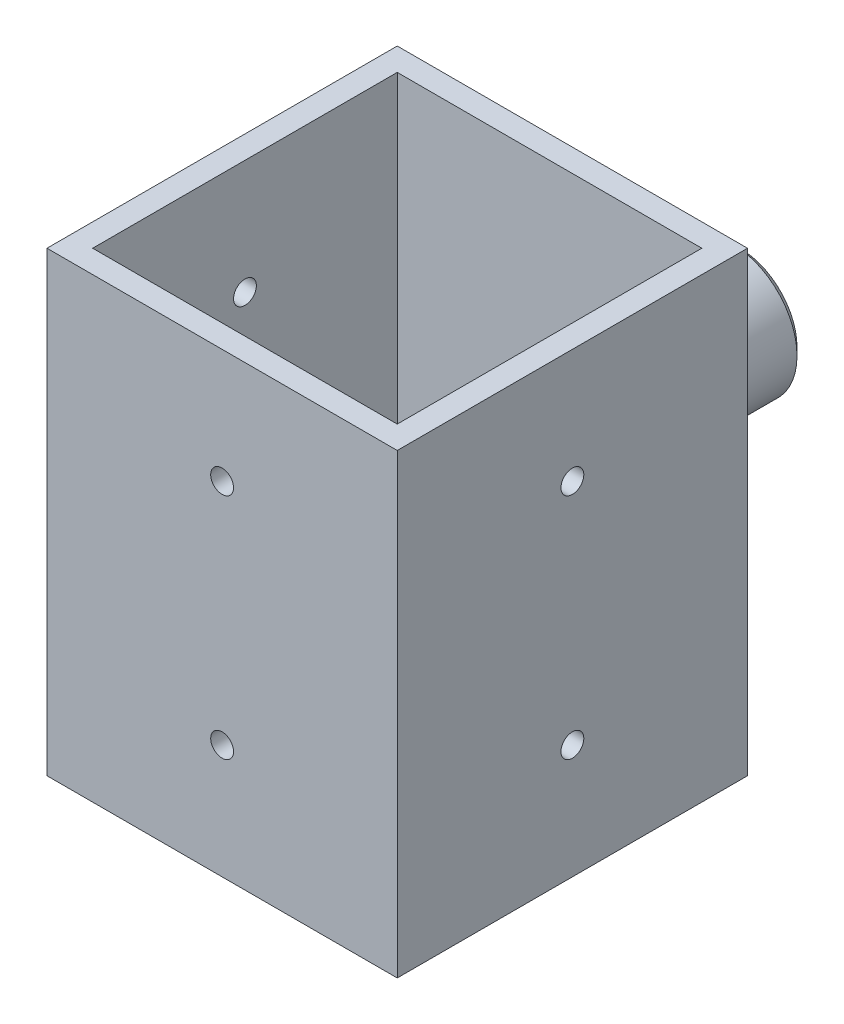
ISO-10303-21;
HEADER;
FILE_DESCRIPTION(('STEP AP214'),'2;1');
FILE_NAME('part.step','',(''),(''),'','','');
FILE_SCHEMA(('AUTOMOTIVE_DESIGN { 1 0 10303 214 1 1 1 1 }'));
ENDSEC;
DATA;
#1=APPLICATION_CONTEXT('core data for automotive mechanical design processes');
#2=APPLICATION_PROTOCOL_DEFINITION('international standard','automotive_design',2000,#1);
#3=PRODUCT_CONTEXT('',#1,'mechanical');
#4=PRODUCT('Part','Part','',(#3));
#5=PRODUCT_RELATED_PRODUCT_CATEGORY('part','',(#4));
#6=PRODUCT_DEFINITION_FORMATION('','',#4);
#7=PRODUCT_DEFINITION_CONTEXT('part definition',#1,'design');
#8=PRODUCT_DEFINITION('design','',#6,#7);
#9=PRODUCT_DEFINITION_SHAPE('','',#8);
#10=(LENGTH_UNIT() NAMED_UNIT(*) SI_UNIT(.MILLI.,.METRE.));
#11=(NAMED_UNIT(*) PLANE_ANGLE_UNIT() SI_UNIT($,.RADIAN.));
#12=(NAMED_UNIT(*) SI_UNIT($,.STERADIAN.) SOLID_ANGLE_UNIT());
#13=UNCERTAINTY_MEASURE_WITH_UNIT(LENGTH_MEASURE(1.E-05),#10,'distance_accuracy_value','');
#14=(GEOMETRIC_REPRESENTATION_CONTEXT(3) GLOBAL_UNCERTAINTY_ASSIGNED_CONTEXT((#13)) GLOBAL_UNIT_ASSIGNED_CONTEXT((#10,
#11,#12)) REPRESENTATION_CONTEXT('',''));
#15=CARTESIAN_POINT('',(0.,0.,0.));
#16=DIRECTION('',(0.,0.,1.));
#17=DIRECTION('',(1.,0.,0.));
#18=AXIS2_PLACEMENT_3D('',#15,#16,#17);
#19=CARTESIAN_POINT('',(0.,0.,10.));
#20=DIRECTION('',(0.,0.,-1.));
#21=DIRECTION('',(-1.,0.,0.));
#22=AXIS2_PLACEMENT_3D('',#19,#20,#21);
#23=CYLINDRICAL_SURFACE('',#22,8.5);
#24=CARTESIAN_POINT('',(0.,0.,0.999999999999999));
#25=DIRECTION('',(0.,0.,1.));
#26=DIRECTION('',(1.,0.,0.));
#27=AXIS2_PLACEMENT_3D('',#24,#25,#26);
#28=CIRCLE('',#27,8.5);
#29=CARTESIAN_POINT('',(8.5,0.,0.999999999999999));
#30=VERTEX_POINT('',#29);
#31=EDGE_CURVE('E201',#30,#30,#28,.T.);
#32=ORIENTED_EDGE('',*,*,#31,.T.);
#33=EDGE_LOOP('',(#32));
#34=FACE_BOUND('',#33,.T.);
#35=CARTESIAN_POINT('',(0.,0.,10.));
#36=DIRECTION('',(0.,0.,1.));
#37=DIRECTION('',(1.,0.,0.));
#38=AXIS2_PLACEMENT_3D('',#35,#36,#37);
#39=CIRCLE('',#38,8.5);
#40=CARTESIAN_POINT('',(8.5,0.,10.));
#41=VERTEX_POINT('',#40);
#42=EDGE_CURVE('E198',#41,#41,#39,.T.);
#43=ORIENTED_EDGE('',*,*,#42,.F.);
#44=EDGE_LOOP('',(#43));
#45=FACE_BOUND('',#44,.T.);
#46=ADVANCED_FACE('F39',(#34,#45),#23,.T.);
#47=CARTESIAN_POINT('',(0.,0.,0.));
#48=DIRECTION('',(0.,0.,1.));
#49=DIRECTION('',(1.,0.,0.));
#50=AXIS2_PLACEMENT_3D('',#47,#48,#49);
#51=PLANE('',#50);
#52=CARTESIAN_POINT('',(0.,0.,0.));
#53=DIRECTION('',(0.,0.,1.));
#54=DIRECTION('',(1.,0.,0.));
#55=AXIS2_PLACEMENT_3D('',#52,#53,#54);
#56=CIRCLE('',#55,7.5);
#57=CARTESIAN_POINT('',(7.5,0.,0.));
#58=VERTEX_POINT('',#57);
#59=EDGE_CURVE('E204',#58,#58,#56,.F.);
#60=ORIENTED_EDGE('',*,*,#59,.T.);
#61=EDGE_LOOP('',(#60));
#62=FACE_BOUND('',#61,.T.);
#63=CARTESIAN_POINT('',(0.,4.9,0.));
#64=DIRECTION('',(0.,0.,-1.));
#65=DIRECTION('',(-1.,0.,0.));
#66=AXIS2_PLACEMENT_3D('',#63,#64,#65);
#67=CIRCLE('',#66,2.);
#68=CARTESIAN_POINT('',(-2.,4.9,0.));
#69=VERTEX_POINT('',#68);
#70=EDGE_CURVE('E182',#69,#69,#67,.T.);
#71=ORIENTED_EDGE('',*,*,#70,.F.);
#72=EDGE_LOOP('',(#71));
#73=FACE_BOUND('',#72,.T.);
#74=CARTESIAN_POINT('',(-4.24352447854427,-2.4499999999997,0.));
#75=DIRECTION('',(0.,0.,-1.));
#76=DIRECTION('',(-1.,0.,0.));
#77=AXIS2_PLACEMENT_3D('',#74,#75,#76);
#78=CIRCLE('',#77,2.00000000000043);
#79=CARTESIAN_POINT('',(-6.2435244785447,-2.4499999999997,0.));
#80=VERTEX_POINT('',#79);
#81=EDGE_CURVE('E185',#80,#80,#78,.T.);
#82=ORIENTED_EDGE('',*,*,#81,.F.);
#83=EDGE_LOOP('',(#82));
#84=FACE_BOUND('',#83,.T.);
#85=CARTESIAN_POINT('',(4.24352447854323,-2.4500000000003,0.));
#86=DIRECTION('',(0.,0.,-1.));
#87=DIRECTION('',(-1.,0.,0.));
#88=AXIS2_PLACEMENT_3D('',#85,#86,#87);
#89=CIRCLE('',#88,2.00000000000063);
#90=CARTESIAN_POINT('',(2.2435244785426,-2.4500000000003,0.));
#91=VERTEX_POINT('',#90);
#92=EDGE_CURVE('E191',#91,#91,#89,.T.);
#93=ORIENTED_EDGE('',*,*,#92,.F.);
#94=EDGE_LOOP('',(#93));
#95=FACE_BOUND('',#94,.T.);
#96=ADVANCED_FACE('F241',(#62,#73,#84,#95),#51,.F.);
#97=CARTESIAN_POINT('',(0.,0.,22.));
#98=DIRECTION('',(0.,0.,-1.));
#99=DIRECTION('',(-1.,0.,0.));
#100=AXIS2_PLACEMENT_3D('',#97,#98,#99);
#101=CYLINDRICAL_SURFACE('',#100,11.);
#102=CARTESIAN_POINT('',(0.,0.,12.));
#103=DIRECTION('',(0.,0.,-1.));
#104=DIRECTION('',(-1.,0.,0.));
#105=AXIS2_PLACEMENT_3D('',#102,#103,#104);
#106=CIRCLE('',#105,11.);
#107=CARTESIAN_POINT('',(-11.,0.,12.));
#108=VERTEX_POINT('',#107);
#109=EDGE_CURVE('E11',#108,#108,#106,.T.);
#110=ORIENTED_EDGE('',*,*,#109,.T.);
#111=EDGE_LOOP('',(#110));
#112=FACE_BOUND('',#111,.T.);
#113=CARTESIAN_POINT('',(0.,0.,10.));
#114=DIRECTION('',(0.,0.,1.));
#115=DIRECTION('',(1.,0.,0.));
#116=AXIS2_PLACEMENT_3D('',#113,#114,#115);
#117=CIRCLE('',#116,11.);
#118=CARTESIAN_POINT('',(11.,0.,10.));
#119=VERTEX_POINT('',#118);
#120=EDGE_CURVE('E181',#119,#119,#117,.T.);
#121=ORIENTED_EDGE('',*,*,#120,.T.);
#122=EDGE_LOOP('',(#121));
#123=FACE_BOUND('',#122,.T.);
#124=ADVANCED_FACE('F247',(#112,#123),#101,.T.);
#125=CARTESIAN_POINT('',(0.,0.,10.));
#126=DIRECTION('',(0.,0.,1.));
#127=DIRECTION('',(1.,0.,0.));
#128=AXIS2_PLACEMENT_3D('',#125,#126,#127);
#129=PLANE('',#128);
#130=ORIENTED_EDGE('',*,*,#42,.T.);
#131=EDGE_LOOP('',(#130));
#132=FACE_BOUND('',#131,.T.);
#133=ORIENTED_EDGE('',*,*,#120,.F.);
#134=EDGE_LOOP('',(#133));
#135=FACE_BOUND('',#134,.T.);
#136=ADVANCED_FACE('F282',(#132,#135),#129,.F.);
#137=CARTESIAN_POINT('',(4.24352447854323,-2.4500000000003,8.));
#138=DIRECTION('',(0.,0.,-1.));
#139=DIRECTION('',(-1.,0.,0.));
#140=AXIS2_PLACEMENT_3D('',#137,#138,#139);
#141=CYLINDRICAL_SURFACE('',#140,2.00000000000063);
#142=CARTESIAN_POINT('',(4.24352447854323,-2.4500000000003,8.));
#143=DIRECTION('',(0.,0.,-1.));
#144=DIRECTION('',(-1.,0.,0.));
#145=AXIS2_PLACEMENT_3D('',#142,#143,#144);
#146=CIRCLE('',#145,2.00000000000063);
#147=CARTESIAN_POINT('',(2.2435244785426,-2.4500000000003,8.));
#148=VERTEX_POINT('',#147);
#149=EDGE_CURVE('E172',#148,#148,#146,.T.);
#150=ORIENTED_EDGE('',*,*,#149,.F.);
#151=EDGE_LOOP('',(#150));
#152=FACE_BOUND('',#151,.T.);
#153=ORIENTED_EDGE('',*,*,#92,.T.);
#154=EDGE_LOOP('',(#153));
#155=FACE_BOUND('',#154,.T.);
#156=ADVANCED_FACE('F279',(#152,#155),#141,.F.);
#157=CARTESIAN_POINT('',(4.24352447854323,-2.4500000000003,8.));
#158=DIRECTION('',(0.,0.,-1.));
#159=DIRECTION('',(-1.,0.,0.));
#160=AXIS2_PLACEMENT_3D('',#157,#158,#159);
#161=PLANE('',#160);
#162=ORIENTED_EDGE('',*,*,#149,.T.);
#163=EDGE_LOOP('',(#162));
#164=FACE_BOUND('',#163,.T.);
#165=ADVANCED_FACE('F281',(#164),#161,.T.);
#166=CARTESIAN_POINT('',(-4.24352447854427,-2.4499999999997,8.));
#167=DIRECTION('',(0.,0.,-1.));
#168=DIRECTION('',(-1.,0.,0.));
#169=AXIS2_PLACEMENT_3D('',#166,#167,#168);
#170=CYLINDRICAL_SURFACE('',#169,2.00000000000043);
#171=CARTESIAN_POINT('',(-4.24352447854427,-2.4499999999997,8.));
#172=DIRECTION('',(0.,0.,-1.));
#173=DIRECTION('',(-1.,0.,0.));
#174=AXIS2_PLACEMENT_3D('',#171,#172,#173);
#175=CIRCLE('',#174,2.00000000000043);
#176=CARTESIAN_POINT('',(-6.2435244785447,-2.4499999999997,8.));
#177=VERTEX_POINT('',#176);
#178=EDGE_CURVE('E188',#177,#177,#175,.T.);
#179=ORIENTED_EDGE('',*,*,#178,.F.);
#180=EDGE_LOOP('',(#179));
#181=FACE_BOUND('',#180,.T.);
#182=ORIENTED_EDGE('',*,*,#81,.T.);
#183=EDGE_LOOP('',(#182));
#184=FACE_BOUND('',#183,.T.);
#185=ADVANCED_FACE('F289',(#181,#184),#170,.F.);
#186=CARTESIAN_POINT('',(-4.24352447854427,-2.4499999999997,8.));
#187=DIRECTION('',(0.,0.,-1.));
#188=DIRECTION('',(-1.,0.,0.));
#189=AXIS2_PLACEMENT_3D('',#186,#187,#188);
#190=PLANE('',#189);
#191=ORIENTED_EDGE('',*,*,#178,.T.);
#192=EDGE_LOOP('',(#191));
#193=FACE_BOUND('',#192,.T.);
#194=ADVANCED_FACE('F296',(#193),#190,.T.);
#195=CARTESIAN_POINT('',(0.,4.9,8.));
#196=DIRECTION('',(0.,0.,-1.));
#197=DIRECTION('',(-1.,0.,0.));
#198=AXIS2_PLACEMENT_3D('',#195,#196,#197);
#199=CYLINDRICAL_SURFACE('',#198,2.);
#200=CARTESIAN_POINT('',(0.,4.9,8.));
#201=DIRECTION('',(0.,0.,-1.));
#202=DIRECTION('',(-1.,0.,0.));
#203=AXIS2_PLACEMENT_3D('',#200,#201,#202);
#204=CIRCLE('',#203,2.);
#205=CARTESIAN_POINT('',(-2.,4.9,8.));
#206=VERTEX_POINT('',#205);
#207=EDGE_CURVE('E178',#206,#206,#204,.T.);
#208=ORIENTED_EDGE('',*,*,#207,.F.);
#209=EDGE_LOOP('',(#208));
#210=FACE_BOUND('',#209,.T.);
#211=ORIENTED_EDGE('',*,*,#70,.T.);
#212=EDGE_LOOP('',(#211));
#213=FACE_BOUND('',#212,.T.);
#214=ADVANCED_FACE('F266',(#210,#213),#199,.F.);
#215=CARTESIAN_POINT('',(0.,4.9,8.));
#216=DIRECTION('',(0.,0.,-1.));
#217=DIRECTION('',(-1.,0.,0.));
#218=AXIS2_PLACEMENT_3D('',#215,#216,#217);
#219=PLANE('',#218);
#220=ORIENTED_EDGE('',*,*,#207,.T.);
#221=EDGE_LOOP('',(#220));
#222=FACE_BOUND('',#221,.T.);
#223=ADVANCED_FACE('F258',(#222),#219,.T.);
#224=CARTESIAN_POINT('',(0.,0.,0.999999999999999));
#225=DIRECTION('',(0.,0.,1.));
#226=DIRECTION('',(1.,0.,0.));
#227=AXIS2_PLACEMENT_3D('',#224,#225,#226);
#228=CONICAL_SURFACE('',#227,8.5,0.785398163397449);
#229=ORIENTED_EDGE('',*,*,#59,.F.);
#230=EDGE_LOOP('',(#229));
#231=FACE_BOUND('',#230,.T.);
#232=ORIENTED_EDGE('',*,*,#31,.F.);
#233=EDGE_LOOP('',(#232));
#234=FACE_BOUND('',#233,.T.);
#235=ADVANCED_FACE('F253',(#231,#234),#228,.T.);
#236=CARTESIAN_POINT('',(-23.,-30.,22.));
#237=DIRECTION('',(-1.,0.,0.));
#238=DIRECTION('',(0.,0.,1.));
#239=AXIS2_PLACEMENT_3D('',#236,#237,#238);
#240=PLANE('',#239);
#241=CARTESIAN_POINT('',(-23.,15.,45.));
#242=DIRECTION('',(1.,0.,0.));
#243=DIRECTION('',(0.,0.,-1.));
#244=AXIS2_PLACEMENT_3D('',#241,#242,#243);
#245=CIRCLE('',#244,1.5);
#246=CARTESIAN_POINT('',(-23.,15.,43.5));
#247=VERTEX_POINT('',#246);
#248=EDGE_CURVE('E211',#247,#247,#245,.T.);
#249=ORIENTED_EDGE('',*,*,#248,.T.);
#250=EDGE_LOOP('',(#249));
#251=FACE_BOUND('',#250,.T.);
#252=CARTESIAN_POINT('',(-23.,-15.,45.));
#253=DIRECTION('',(1.,0.,0.));
#254=DIRECTION('',(0.,0.,-1.));
#255=AXIS2_PLACEMENT_3D('',#252,#253,#254);
#256=CIRCLE('',#255,1.5);
#257=CARTESIAN_POINT('',(-23.,-15.,43.5));
#258=VERTEX_POINT('',#257);
#259=EDGE_CURVE('E223',#258,#258,#256,.T.);
#260=ORIENTED_EDGE('',*,*,#259,.T.);
#261=EDGE_LOOP('',(#260));
#262=FACE_BOUND('',#261,.T.);
#263=DIRECTION('',(0.,1.,0.));
#264=VECTOR('',#263,1.);
#265=CARTESIAN_POINT('',(-23.,-30.,68.));
#266=LINE('',#265,#264);
#267=CARTESIAN_POINT('',(-23.,-30.,68.));
#268=VERTEX_POINT('',#267);
#269=CARTESIAN_POINT('',(-23.,30.,68.));
#270=VERTEX_POINT('',#269);
#271=EDGE_CURVE('E170',#268,#270,#266,.T.);
#272=ORIENTED_EDGE('',*,*,#271,.T.);
#273=DIRECTION('',(0.,0.,1.));
#274=VECTOR('',#273,1.);
#275=CARTESIAN_POINT('',(-23.,30.,22.));
#276=LINE('',#275,#274);
#277=CARTESIAN_POINT('',(-23.,30.,22.));
#278=VERTEX_POINT('',#277);
#279=EDGE_CURVE('E137',#278,#270,#276,.T.);
#280=ORIENTED_EDGE('',*,*,#279,.F.);
#281=DIRECTION('',(0.,1.,0.));
#282=VECTOR('',#281,1.);
#283=CARTESIAN_POINT('',(-23.,-30.,22.));
#284=LINE('',#283,#282);
#285=CARTESIAN_POINT('',(-23.,-30.,22.));
#286=VERTEX_POINT('',#285);
#287=EDGE_CURVE('E62',#286,#278,#284,.T.);
#288=ORIENTED_EDGE('',*,*,#287,.F.);
#289=DIRECTION('',(0.,0.,1.));
#290=VECTOR('',#289,1.);
#291=CARTESIAN_POINT('',(-23.,-30.,22.));
#292=LINE('',#291,#290);
#293=EDGE_CURVE('E156',#286,#268,#292,.T.);
#294=ORIENTED_EDGE('',*,*,#293,.T.);
#295=EDGE_LOOP('',(#272,#280,#288,#294));
#296=FACE_BOUND('',#295,.T.);
#297=ADVANCED_FACE('F257',(#251,#262,#296),#240,.T.);
#298=CARTESIAN_POINT('',(-23.,-30.,22.));
#299=DIRECTION('',(0.,0.,-1.));
#300=DIRECTION('',(-1.,0.,0.));
#301=AXIS2_PLACEMENT_3D('',#298,#299,#300);
#302=PLANE('',#301);
#303=CARTESIAN_POINT('',(0.,0.,22.));
#304=DIRECTION('',(0.,0.,-1.));
#305=DIRECTION('',(-1.,0.,0.));
#306=AXIS2_PLACEMENT_3D('',#303,#304,#305);
#307=CIRCLE('',#306,21.);
#308=CARTESIAN_POINT('',(-21.,0.,22.));
#309=VERTEX_POINT('',#308);
#310=EDGE_CURVE('E47',#309,#309,#307,.F.);
#311=ORIENTED_EDGE('',*,*,#310,.T.);
#312=EDGE_LOOP('',(#311));
#313=FACE_BOUND('',#312,.T.);
#314=ORIENTED_EDGE('',*,*,#287,.T.);
#315=DIRECTION('',(-1.,0.,0.));
#316=VECTOR('',#315,1.);
#317=CARTESIAN_POINT('',(-23.,30.,22.));
#318=LINE('',#317,#316);
#319=CARTESIAN_POINT('',(23.,30.,22.));
#320=VERTEX_POINT('',#319);
#321=EDGE_CURVE('E146',#320,#278,#318,.T.);
#322=ORIENTED_EDGE('',*,*,#321,.F.);
#323=DIRECTION('',(0.,1.,0.));
#324=VECTOR('',#323,1.);
#325=CARTESIAN_POINT('',(23.,-30.,22.));
#326=LINE('',#325,#324);
#327=CARTESIAN_POINT('',(23.,-30.,22.));
#328=VERTEX_POINT('',#327);
#329=EDGE_CURVE('E173',#328,#320,#326,.T.);
#330=ORIENTED_EDGE('',*,*,#329,.F.);
#331=DIRECTION('',(-1.,0.,0.));
#332=VECTOR('',#331,1.);
#333=CARTESIAN_POINT('',(-23.,-30.,22.));
#334=LINE('',#333,#332);
#335=EDGE_CURVE('E167',#328,#286,#334,.T.);
#336=ORIENTED_EDGE('',*,*,#335,.T.);
#337=EDGE_LOOP('',(#314,#322,#330,#336));
#338=FACE_BOUND('',#337,.T.);
#339=ADVANCED_FACE('F227',(#313,#338),#302,.T.);
#340=CARTESIAN_POINT('',(23.,-30.,22.));
#341=DIRECTION('',(1.,0.,0.));
#342=DIRECTION('',(0.,0.,-1.));
#343=AXIS2_PLACEMENT_3D('',#340,#341,#342);
#344=PLANE('',#343);
#345=CARTESIAN_POINT('',(23.,15.,45.));
#346=DIRECTION('',(1.,0.,0.));
#347=DIRECTION('',(0.,0.,-1.));
#348=AXIS2_PLACEMENT_3D('',#345,#346,#347);
#349=CIRCLE('',#348,1.5);
#350=CARTESIAN_POINT('',(23.,15.,43.5));
#351=VERTEX_POINT('',#350);
#352=EDGE_CURVE('E126',#351,#351,#349,.T.);
#353=ORIENTED_EDGE('',*,*,#352,.F.);
#354=EDGE_LOOP('',(#353));
#355=FACE_BOUND('',#354,.T.);
#356=CARTESIAN_POINT('',(23.,-15.,45.));
#357=DIRECTION('',(1.,0.,0.));
#358=DIRECTION('',(0.,0.,-1.));
#359=AXIS2_PLACEMENT_3D('',#356,#357,#358);
#360=CIRCLE('',#359,1.5);
#361=CARTESIAN_POINT('',(23.,-15.,43.5));
#362=VERTEX_POINT('',#361);
#363=EDGE_CURVE('E216',#362,#362,#360,.T.);
#364=ORIENTED_EDGE('',*,*,#363,.F.);
#365=EDGE_LOOP('',(#364));
#366=FACE_BOUND('',#365,.T.);
#367=ORIENTED_EDGE('',*,*,#329,.T.);
#368=DIRECTION('',(0.,0.,-1.));
#369=VECTOR('',#368,1.);
#370=CARTESIAN_POINT('',(23.,30.,22.));
#371=LINE('',#370,#369);
#372=CARTESIAN_POINT('',(23.,30.,68.));
#373=VERTEX_POINT('',#372);
#374=EDGE_CURVE('E143',#373,#320,#371,.T.);
#375=ORIENTED_EDGE('',*,*,#374,.F.);
#376=DIRECTION('',(0.,1.,0.));
#377=VECTOR('',#376,1.);
#378=CARTESIAN_POINT('',(23.,-30.,68.));
#379=LINE('',#378,#377);
#380=CARTESIAN_POINT('',(23.,-30.,68.));
#381=VERTEX_POINT('',#380);
#382=EDGE_CURVE('E175',#381,#373,#379,.T.);
#383=ORIENTED_EDGE('',*,*,#382,.F.);
#384=DIRECTION('',(0.,0.,-1.));
#385=VECTOR('',#384,1.);
#386=CARTESIAN_POINT('',(23.,-30.,22.));
#387=LINE('',#386,#385);
#388=EDGE_CURVE('E164',#381,#328,#387,.T.);
#389=ORIENTED_EDGE('',*,*,#388,.T.);
#390=EDGE_LOOP('',(#367,#375,#383,#389));
#391=FACE_BOUND('',#390,.T.);
#392=ADVANCED_FACE('F435',(#355,#366,#391),#344,.T.);
#393=CARTESIAN_POINT('',(-23.,-30.,68.));
#394=DIRECTION('',(0.,0.,1.));
#395=DIRECTION('',(1.,0.,0.));
#396=AXIS2_PLACEMENT_3D('',#393,#394,#395);
#397=PLANE('',#396);
#398=CARTESIAN_POINT('',(0.,15.,68.));
#399=DIRECTION('',(0.,0.,1.));
#400=DIRECTION('',(1.,0.,0.));
#401=AXIS2_PLACEMENT_3D('',#398,#399,#400);
#402=CIRCLE('',#401,1.5);
#403=CARTESIAN_POINT('',(1.5,15.,68.));
#404=VERTEX_POINT('',#403);
#405=EDGE_CURVE('E221',#404,#404,#402,.T.);
#406=ORIENTED_EDGE('',*,*,#405,.F.);
#407=EDGE_LOOP('',(#406));
#408=FACE_BOUND('',#407,.T.);
#409=CARTESIAN_POINT('',(0.,-15.,68.));
#410=DIRECTION('',(0.,0.,1.));
#411=DIRECTION('',(1.,0.,0.));
#412=AXIS2_PLACEMENT_3D('',#409,#410,#411);
#413=CIRCLE('',#412,1.5);
#414=CARTESIAN_POINT('',(1.5,-15.,68.));
#415=VERTEX_POINT('',#414);
#416=EDGE_CURVE('E577',#415,#415,#413,.T.);
#417=ORIENTED_EDGE('',*,*,#416,.F.);
#418=EDGE_LOOP('',(#417));
#419=FACE_BOUND('',#418,.T.);
#420=ORIENTED_EDGE('',*,*,#382,.T.);
#421=DIRECTION('',(1.,0.,0.));
#422=VECTOR('',#421,1.);
#423=CARTESIAN_POINT('',(-23.,30.,68.));
#424=LINE('',#423,#422);
#425=EDGE_CURVE('E140',#270,#373,#424,.T.);
#426=ORIENTED_EDGE('',*,*,#425,.F.);
#427=ORIENTED_EDGE('',*,*,#271,.F.);
#428=DIRECTION('',(1.,0.,0.));
#429=VECTOR('',#428,1.);
#430=CARTESIAN_POINT('',(-23.,-30.,68.));
#431=LINE('',#430,#429);
#432=EDGE_CURVE('E161',#268,#381,#431,.T.);
#433=ORIENTED_EDGE('',*,*,#432,.T.);
#434=EDGE_LOOP('',(#420,#426,#427,#433));
#435=FACE_BOUND('',#434,.T.);
#436=ADVANCED_FACE('F387',(#408,#419,#435),#397,.T.);
#437=CARTESIAN_POINT('',(0.,-30.,0.));
#438=DIRECTION('',(0.,1.,0.));
#439=DIRECTION('',(0.,0.,1.));
#440=AXIS2_PLACEMENT_3D('',#437,#438,#439);
#441=PLANE('',#440);
#442=DIRECTION('',(-1.,0.,0.));
#443=VECTOR('',#442,1.);
#444=CARTESIAN_POINT('',(-20.,-30.,25.));
#445=LINE('',#444,#443);
#446=CARTESIAN_POINT('',(20.,-30.,25.));
#447=VERTEX_POINT('',#446);
#448=CARTESIAN_POINT('',(-20.,-30.,25.));
#449=VERTEX_POINT('',#448);
#450=EDGE_CURVE('E117',#447,#449,#445,.T.);
#451=ORIENTED_EDGE('',*,*,#450,.T.);
#452=DIRECTION('',(0.,0.,1.));
#453=VECTOR('',#452,1.);
#454=CARTESIAN_POINT('',(-20.,-30.,25.));
#455=LINE('',#454,#453);
#456=CARTESIAN_POINT('',(-20.,-30.,65.));
#457=VERTEX_POINT('',#456);
#458=EDGE_CURVE('E149',#449,#457,#455,.T.);
#459=ORIENTED_EDGE('',*,*,#458,.T.);
#460=DIRECTION('',(1.,0.,0.));
#461=VECTOR('',#460,1.);
#462=CARTESIAN_POINT('',(-20.,-30.,65.));
#463=LINE('',#462,#461);
#464=CARTESIAN_POINT('',(20.,-30.,65.));
#465=VERTEX_POINT('',#464);
#466=EDGE_CURVE('E112',#457,#465,#463,.T.);
#467=ORIENTED_EDGE('',*,*,#466,.T.);
#468=DIRECTION('',(0.,0.,-1.));
#469=VECTOR('',#468,1.);
#470=CARTESIAN_POINT('',(20.,-30.,25.));
#471=LINE('',#470,#469);
#472=EDGE_CURVE('E54',#465,#447,#471,.T.);
#473=ORIENTED_EDGE('',*,*,#472,.T.);
#474=EDGE_LOOP('',(#451,#459,#467,#473));
#475=FACE_BOUND('',#474,.T.);
#476=ORIENTED_EDGE('',*,*,#293,.F.);
#477=ORIENTED_EDGE('',*,*,#335,.F.);
#478=ORIENTED_EDGE('',*,*,#388,.F.);
#479=ORIENTED_EDGE('',*,*,#432,.F.);
#480=EDGE_LOOP('',(#476,#477,#478,#479));
#481=FACE_BOUND('',#480,.T.);
#482=ADVANCED_FACE('F382',(#475,#481),#441,.F.);
#483=CARTESIAN_POINT('',(-20.,-30.,25.));
#484=DIRECTION('',(-1.,0.,0.));
#485=DIRECTION('',(0.,0.,1.));
#486=AXIS2_PLACEMENT_3D('',#483,#484,#485);
#487=PLANE('',#486);
#488=CARTESIAN_POINT('',(-20.,15.,45.));
#489=DIRECTION('',(-1.,0.,0.));
#490=DIRECTION('',(0.,0.,1.));
#491=AXIS2_PLACEMENT_3D('',#488,#489,#490);
#492=CIRCLE('',#491,1.5);
#493=CARTESIAN_POINT('',(-20.,15.,46.5));
#494=VERTEX_POINT('',#493);
#495=EDGE_CURVE('E215',#494,#494,#492,.T.);
#496=ORIENTED_EDGE('',*,*,#495,.T.);
#497=EDGE_LOOP('',(#496));
#498=FACE_BOUND('',#497,.T.);
#499=CARTESIAN_POINT('',(-20.,-15.,45.));
#500=DIRECTION('',(-1.,0.,0.));
#501=DIRECTION('',(0.,0.,1.));
#502=AXIS2_PLACEMENT_3D('',#499,#500,#501);
#503=CIRCLE('',#502,1.5);
#504=CARTESIAN_POINT('',(-20.,-15.,46.5));
#505=VERTEX_POINT('',#504);
#506=EDGE_CURVE('E210',#505,#505,#503,.T.);
#507=ORIENTED_EDGE('',*,*,#506,.T.);
#508=EDGE_LOOP('',(#507));
#509=FACE_BOUND('',#508,.T.);
#510=DIRECTION('',(0.,1.,0.));
#511=VECTOR('',#510,1.);
#512=CARTESIAN_POINT('',(-20.,-30.,25.));
#513=LINE('',#512,#511);
#514=CARTESIAN_POINT('',(-20.,30.,25.));
#515=VERTEX_POINT('',#514);
#516=EDGE_CURVE('E122',#449,#515,#513,.T.);
#517=ORIENTED_EDGE('',*,*,#516,.T.);
#518=DIRECTION('',(0.,0.,1.));
#519=VECTOR('',#518,1.);
#520=CARTESIAN_POINT('',(-20.,30.,25.));
#521=LINE('',#520,#519);
#522=CARTESIAN_POINT('',(-20.,30.,65.));
#523=VERTEX_POINT('',#522);
#524=EDGE_CURVE('E120',#515,#523,#521,.T.);
#525=ORIENTED_EDGE('',*,*,#524,.T.);
#526=DIRECTION('',(0.,1.,0.));
#527=VECTOR('',#526,1.);
#528=CARTESIAN_POINT('',(-20.,-30.,65.));
#529=LINE('',#528,#527);
#530=EDGE_CURVE('E105',#457,#523,#529,.T.);
#531=ORIENTED_EDGE('',*,*,#530,.F.);
#532=ORIENTED_EDGE('',*,*,#458,.F.);
#533=EDGE_LOOP('',(#517,#525,#531,#532));
#534=FACE_BOUND('',#533,.T.);
#535=ADVANCED_FACE('F121',(#498,#509,#534),#487,.F.);
#536=CARTESIAN_POINT('',(-20.,-30.,25.));
#537=DIRECTION('',(0.,0.,-1.));
#538=DIRECTION('',(-1.,0.,0.));
#539=AXIS2_PLACEMENT_3D('',#536,#537,#538);
#540=PLANE('',#539);
#541=DIRECTION('',(0.,1.,0.));
#542=VECTOR('',#541,1.);
#543=CARTESIAN_POINT('',(20.,-30.,25.));
#544=LINE('',#543,#542);
#545=CARTESIAN_POINT('',(20.,30.,25.));
#546=VERTEX_POINT('',#545);
#547=EDGE_CURVE('E157',#447,#546,#544,.T.);
#548=ORIENTED_EDGE('',*,*,#547,.T.);
#549=DIRECTION('',(-1.,0.,0.));
#550=VECTOR('',#549,1.);
#551=CARTESIAN_POINT('',(-20.,30.,25.));
#552=LINE('',#551,#550);
#553=EDGE_CURVE('E132',#546,#515,#552,.T.);
#554=ORIENTED_EDGE('',*,*,#553,.T.);
#555=ORIENTED_EDGE('',*,*,#516,.F.);
#556=ORIENTED_EDGE('',*,*,#450,.F.);
#557=EDGE_LOOP('',(#548,#554,#555,#556));
#558=FACE_BOUND('',#557,.T.);
#559=ADVANCED_FACE('F398',(#558),#540,.F.);
#560=CARTESIAN_POINT('',(20.,-30.,25.));
#561=DIRECTION('',(1.,0.,0.));
#562=DIRECTION('',(0.,0.,-1.));
#563=AXIS2_PLACEMENT_3D('',#560,#561,#562);
#564=PLANE('',#563);
#565=CARTESIAN_POINT('',(20.,15.,45.));
#566=DIRECTION('',(1.,0.,0.));
#567=DIRECTION('',(0.,0.,-1.));
#568=AXIS2_PLACEMENT_3D('',#565,#566,#567);
#569=CIRCLE('',#568,1.5);
#570=CARTESIAN_POINT('',(20.,15.,43.5));
#571=VERTEX_POINT('',#570);
#572=EDGE_CURVE('E212',#571,#571,#569,.T.);
#573=ORIENTED_EDGE('',*,*,#572,.T.);
#574=EDGE_LOOP('',(#573));
#575=FACE_BOUND('',#574,.T.);
#576=CARTESIAN_POINT('',(20.,-15.,45.));
#577=DIRECTION('',(1.,0.,0.));
#578=DIRECTION('',(0.,0.,-1.));
#579=AXIS2_PLACEMENT_3D('',#576,#577,#578);
#580=CIRCLE('',#579,1.5);
#581=CARTESIAN_POINT('',(20.,-15.,43.5));
#582=VERTEX_POINT('',#581);
#583=EDGE_CURVE('E207',#582,#582,#580,.T.);
#584=ORIENTED_EDGE('',*,*,#583,.T.);
#585=EDGE_LOOP('',(#584));
#586=FACE_BOUND('',#585,.T.);
#587=DIRECTION('',(0.,1.,0.));
#588=VECTOR('',#587,1.);
#589=CARTESIAN_POINT('',(20.,-30.,65.));
#590=LINE('',#589,#588);
#591=CARTESIAN_POINT('',(20.,30.,65.));
#592=VERTEX_POINT('',#591);
#593=EDGE_CURVE('E116',#465,#592,#590,.T.);
#594=ORIENTED_EDGE('',*,*,#593,.T.);
#595=DIRECTION('',(0.,0.,-1.));
#596=VECTOR('',#595,1.);
#597=CARTESIAN_POINT('',(20.,30.,25.));
#598=LINE('',#597,#596);
#599=EDGE_CURVE('E130',#592,#546,#598,.T.);
#600=ORIENTED_EDGE('',*,*,#599,.T.);
#601=ORIENTED_EDGE('',*,*,#547,.F.);
#602=ORIENTED_EDGE('',*,*,#472,.F.);
#603=EDGE_LOOP('',(#594,#600,#601,#602));
#604=FACE_BOUND('',#603,.T.);
#605=ADVANCED_FACE('F403',(#575,#586,#604),#564,.F.);
#606=CARTESIAN_POINT('',(-20.,-30.,65.));
#607=DIRECTION('',(0.,0.,1.));
#608=DIRECTION('',(1.,0.,0.));
#609=AXIS2_PLACEMENT_3D('',#606,#607,#608);
#610=PLANE('',#609);
#611=CARTESIAN_POINT('',(0.,15.,65.));
#612=DIRECTION('',(0.,0.,1.));
#613=DIRECTION('',(1.,0.,0.));
#614=AXIS2_PLACEMENT_3D('',#611,#612,#613);
#615=CIRCLE('',#614,1.5);
#616=CARTESIAN_POINT('',(1.5,15.,65.));
#617=VERTEX_POINT('',#616);
#618=EDGE_CURVE('E220',#617,#617,#615,.T.);
#619=ORIENTED_EDGE('',*,*,#618,.T.);
#620=EDGE_LOOP('',(#619));
#621=FACE_BOUND('',#620,.T.);
#622=CARTESIAN_POINT('',(0.,-15.,65.));
#623=DIRECTION('',(0.,0.,1.));
#624=DIRECTION('',(1.,0.,0.));
#625=AXIS2_PLACEMENT_3D('',#622,#623,#624);
#626=CIRCLE('',#625,1.5);
#627=CARTESIAN_POINT('',(1.5,-15.,65.));
#628=VERTEX_POINT('',#627);
#629=EDGE_CURVE('E217',#628,#628,#626,.T.);
#630=ORIENTED_EDGE('',*,*,#629,.T.);
#631=EDGE_LOOP('',(#630));
#632=FACE_BOUND('',#631,.T.);
#633=ORIENTED_EDGE('',*,*,#530,.T.);
#634=DIRECTION('',(1.,0.,0.));
#635=VECTOR('',#634,1.);
#636=CARTESIAN_POINT('',(-20.,30.,65.));
#637=LINE('',#636,#635);
#638=EDGE_CURVE('E109',#523,#592,#637,.T.);
#639=ORIENTED_EDGE('',*,*,#638,.T.);
#640=ORIENTED_EDGE('',*,*,#593,.F.);
#641=ORIENTED_EDGE('',*,*,#466,.F.);
#642=EDGE_LOOP('',(#633,#639,#640,#641));
#643=FACE_BOUND('',#642,.T.);
#644=ADVANCED_FACE('F107',(#621,#632,#643),#610,.F.);
#645=CARTESIAN_POINT('',(0.,30.,0.));
#646=DIRECTION('',(0.,1.,0.));
#647=DIRECTION('',(0.,0.,1.));
#648=AXIS2_PLACEMENT_3D('',#645,#646,#647);
#649=PLANE('',#648);
#650=ORIENTED_EDGE('',*,*,#279,.T.);
#651=ORIENTED_EDGE('',*,*,#425,.T.);
#652=ORIENTED_EDGE('',*,*,#374,.T.);
#653=ORIENTED_EDGE('',*,*,#321,.T.);
#654=EDGE_LOOP('',(#650,#651,#652,#653));
#655=FACE_BOUND('',#654,.T.);
#656=ORIENTED_EDGE('',*,*,#638,.F.);
#657=ORIENTED_EDGE('',*,*,#524,.F.);
#658=ORIENTED_EDGE('',*,*,#553,.F.);
#659=ORIENTED_EDGE('',*,*,#599,.F.);
#660=EDGE_LOOP('',(#656,#657,#658,#659));
#661=FACE_BOUND('',#660,.T.);
#662=ADVANCED_FACE('F128',(#655,#661),#649,.T.);
#663=CARTESIAN_POINT('',(-23.,-15.,45.));
#664=DIRECTION('',(1.,0.,0.));
#665=DIRECTION('',(0.,0.,-1.));
#666=AXIS2_PLACEMENT_3D('',#663,#664,#665);
#667=CYLINDRICAL_SURFACE('',#666,1.5);
#668=ORIENTED_EDGE('',*,*,#363,.T.);
#669=EDGE_LOOP('',(#668));
#670=FACE_BOUND('',#669,.T.);
#671=ORIENTED_EDGE('',*,*,#583,.F.);
#672=EDGE_LOOP('',(#671));
#673=FACE_BOUND('',#672,.T.);
#674=ADVANCED_FACE('F416',(#670,#673),#667,.F.);
#675=CARTESIAN_POINT('',(-23.,15.,45.));
#676=DIRECTION('',(1.,0.,0.));
#677=DIRECTION('',(0.,0.,-1.));
#678=AXIS2_PLACEMENT_3D('',#675,#676,#677);
#679=CYLINDRICAL_SURFACE('',#678,1.5);
#680=ORIENTED_EDGE('',*,*,#352,.T.);
#681=EDGE_LOOP('',(#680));
#682=FACE_BOUND('',#681,.T.);
#683=ORIENTED_EDGE('',*,*,#572,.F.);
#684=EDGE_LOOP('',(#683));
#685=FACE_BOUND('',#684,.T.);
#686=ADVANCED_FACE('F464',(#682,#685),#679,.F.);
#687=ORIENTED_EDGE('',*,*,#259,.F.);
#688=EDGE_LOOP('',(#687));
#689=FACE_BOUND('',#688,.T.);
#690=ORIENTED_EDGE('',*,*,#506,.F.);
#691=EDGE_LOOP('',(#690));
#692=FACE_BOUND('',#691,.T.);
#693=ADVANCED_FACE('F467',(#689,#692),#667,.F.);
#694=ORIENTED_EDGE('',*,*,#248,.F.);
#695=EDGE_LOOP('',(#694));
#696=FACE_BOUND('',#695,.T.);
#697=ORIENTED_EDGE('',*,*,#495,.F.);
#698=EDGE_LOOP('',(#697));
#699=FACE_BOUND('',#698,.T.);
#700=ADVANCED_FACE('F478',(#696,#699),#679,.F.);
#701=CARTESIAN_POINT('',(0.,-15.,58.));
#702=DIRECTION('',(0.,0.,1.));
#703=DIRECTION('',(1.,0.,0.));
#704=AXIS2_PLACEMENT_3D('',#701,#702,#703);
#705=CYLINDRICAL_SURFACE('',#704,1.5);
#706=ORIENTED_EDGE('',*,*,#416,.T.);
#707=EDGE_LOOP('',(#706));
#708=FACE_BOUND('',#707,.T.);
#709=ORIENTED_EDGE('',*,*,#629,.F.);
#710=EDGE_LOOP('',(#709));
#711=FACE_BOUND('',#710,.T.);
#712=ADVANCED_FACE('F236',(#708,#711),#705,.F.);
#713=CARTESIAN_POINT('',(0.,15.,58.));
#714=DIRECTION('',(0.,0.,1.));
#715=DIRECTION('',(1.,0.,0.));
#716=AXIS2_PLACEMENT_3D('',#713,#714,#715);
#717=CYLINDRICAL_SURFACE('',#716,1.5);
#718=ORIENTED_EDGE('',*,*,#405,.T.);
#719=EDGE_LOOP('',(#718));
#720=FACE_BOUND('',#719,.T.);
#721=ORIENTED_EDGE('',*,*,#618,.F.);
#722=EDGE_LOOP('',(#721));
#723=FACE_BOUND('',#722,.T.);
#724=ADVANCED_FACE('F231',(#720,#723),#717,.F.);
#725=CARTESIAN_POINT('',(0.,0.,12.));
#726=DIRECTION('',(0.,0.,-1.));
#727=DIRECTION('',(-1.,0.,0.));
#728=AXIS2_PLACEMENT_3D('',#725,#726,#727);
#729=TOROIDAL_SURFACE('',#728,21.,10.);
#730=ORIENTED_EDGE('',*,*,#109,.F.);
#731=EDGE_LOOP('',(#730));
#732=FACE_BOUND('',#731,.T.);
#733=ORIENTED_EDGE('',*,*,#310,.F.);
#734=EDGE_LOOP('',(#733));
#735=FACE_BOUND('',#734,.T.);
#736=ADVANCED_FACE('F41',(#732,#735),#729,.F.);
#737=CLOSED_SHELL('',(#46,#96,#124,#136,#156,#165,#185,#194,#214,#223,#235,#297,#339,#392,#436,
#482,#535,#559,#605,#644,#662,#674,#686,#693,#700,#712,#724,#736));
#738=MANIFOLD_SOLID_BREP('B2',#737);
#739=ADVANCED_BREP_SHAPE_REPRESENTATION('',(#18,#738),#14);
#740=SHAPE_DEFINITION_REPRESENTATION(#9,#739);
ENDSEC;
END-ISO-10303-21;
